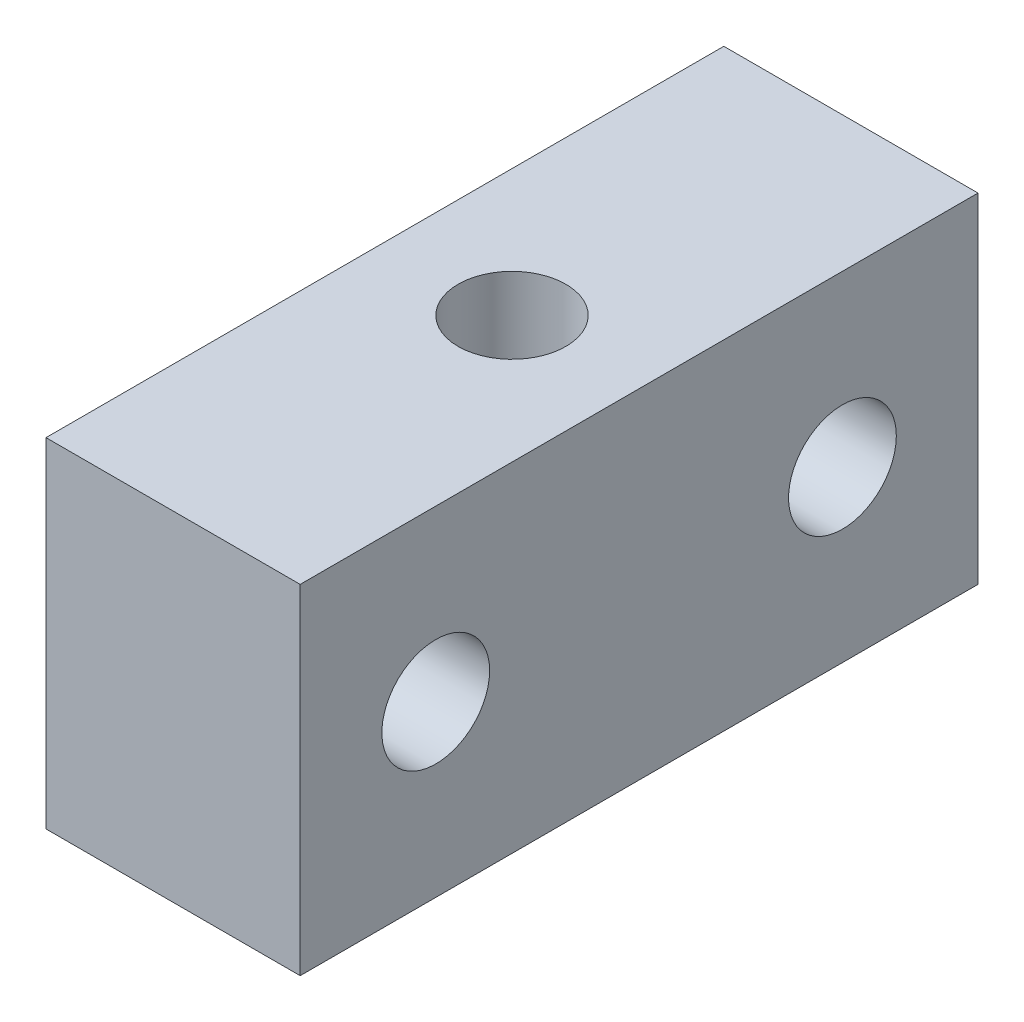
ISO-10303-21;
HEADER;
FILE_DESCRIPTION(('STEP AP214'),'2;1');
FILE_NAME('part.step','',(''),(''),'','','');
FILE_SCHEMA(('AUTOMOTIVE_DESIGN { 1 0 10303 214 1 1 1 1 }'));
ENDSEC;
DATA;
#1=APPLICATION_CONTEXT('core data for automotive mechanical design processes');
#2=APPLICATION_PROTOCOL_DEFINITION('international standard','automotive_design',2000,#1);
#3=PRODUCT_CONTEXT('',#1,'mechanical');
#4=PRODUCT('Part','Part','',(#3));
#5=PRODUCT_RELATED_PRODUCT_CATEGORY('part','',(#4));
#6=PRODUCT_DEFINITION_FORMATION('','',#4);
#7=PRODUCT_DEFINITION_CONTEXT('part definition',#1,'design');
#8=PRODUCT_DEFINITION('design','',#6,#7);
#9=PRODUCT_DEFINITION_SHAPE('','',#8);
#10=(LENGTH_UNIT() NAMED_UNIT(*) SI_UNIT(.MILLI.,.METRE.));
#11=(NAMED_UNIT(*) PLANE_ANGLE_UNIT() SI_UNIT($,.RADIAN.));
#12=(NAMED_UNIT(*) SI_UNIT($,.STERADIAN.) SOLID_ANGLE_UNIT());
#13=UNCERTAINTY_MEASURE_WITH_UNIT(LENGTH_MEASURE(1.E-05),#10,'distance_accuracy_value','');
#14=(GEOMETRIC_REPRESENTATION_CONTEXT(3) GLOBAL_UNCERTAINTY_ASSIGNED_CONTEXT((#13)) GLOBAL_UNIT_ASSIGNED_CONTEXT((#10,
#11,#12)) REPRESENTATION_CONTEXT('',''));
#15=CARTESIAN_POINT('',(0.,0.,0.));
#16=DIRECTION('',(0.,0.,1.));
#17=DIRECTION('',(1.,0.,0.));
#18=AXIS2_PLACEMENT_3D('',#15,#16,#17);
#19=CARTESIAN_POINT('',(4.7625,6.35,12.7));
#20=DIRECTION('',(0.,-1.,0.));
#21=DIRECTION('',(0.,0.,-1.));
#22=AXIS2_PLACEMENT_3D('',#19,#20,#21);
#23=PLANE('',#22);
#24=CARTESIAN_POINT('',(0.,6.35,0.));
#25=DIRECTION('',(0.,1.,0.));
#26=DIRECTION('',(0.,0.,1.));
#27=AXIS2_PLACEMENT_3D('',#24,#25,#26);
#28=CIRCLE('',#27,2.0193);
#29=CARTESIAN_POINT('',(0.,6.35,2.0193));
#30=VERTEX_POINT('',#29);
#31=EDGE_CURVE('E115',#30,#30,#28,.T.);
#32=ORIENTED_EDGE('',*,*,#31,.F.);
#33=EDGE_LOOP('',(#32));
#34=FACE_BOUND('',#33,.T.);
#35=DIRECTION('',(0.,0.,1.));
#36=VECTOR('',#35,1.);
#37=CARTESIAN_POINT('',(-4.7625,6.35,12.7));
#38=LINE('',#37,#36);
#39=CARTESIAN_POINT('',(-4.7625,6.35,-12.7));
#40=VERTEX_POINT('',#39);
#41=CARTESIAN_POINT('',(-4.7625,6.35,12.7));
#42=VERTEX_POINT('',#41);
#43=EDGE_CURVE('E99',#40,#42,#38,.T.);
#44=ORIENTED_EDGE('',*,*,#43,.T.);
#45=DIRECTION('',(-1.,0.,0.));
#46=VECTOR('',#45,1.);
#47=CARTESIAN_POINT('',(4.7625,6.35,12.7));
#48=LINE('',#47,#46);
#49=CARTESIAN_POINT('',(4.7625,6.35,12.7));
#50=VERTEX_POINT('',#49);
#51=EDGE_CURVE('E11',#50,#42,#48,.T.);
#52=ORIENTED_EDGE('',*,*,#51,.F.);
#53=DIRECTION('',(0.,0.,1.));
#54=VECTOR('',#53,1.);
#55=CARTESIAN_POINT('',(4.7625,6.35,12.7));
#56=LINE('',#55,#54);
#57=CARTESIAN_POINT('',(4.7625,6.35,-12.7));
#58=VERTEX_POINT('',#57);
#59=EDGE_CURVE('E87',#58,#50,#56,.T.);
#60=ORIENTED_EDGE('',*,*,#59,.F.);
#61=DIRECTION('',(-1.,0.,0.));
#62=VECTOR('',#61,1.);
#63=CARTESIAN_POINT('',(4.7625,6.35,-12.7));
#64=LINE('',#63,#62);
#65=EDGE_CURVE('E95',#58,#40,#64,.T.);
#66=ORIENTED_EDGE('',*,*,#65,.T.);
#67=EDGE_LOOP('',(#44,#52,#60,#66));
#68=FACE_BOUND('',#67,.T.);
#69=ADVANCED_FACE('F36',(#34,#68),#23,.F.);
#70=CARTESIAN_POINT('',(4.7625,6.35,12.7));
#71=DIRECTION('',(0.,0.,-1.));
#72=DIRECTION('',(-1.,0.,0.));
#73=AXIS2_PLACEMENT_3D('',#70,#71,#72);
#74=PLANE('',#73);
#75=DIRECTION('',(0.,-1.,0.));
#76=VECTOR('',#75,1.);
#77=CARTESIAN_POINT('',(-4.7625,6.35,12.7));
#78=LINE('',#77,#76);
#79=CARTESIAN_POINT('',(-4.7625,-6.35,12.7));
#80=VERTEX_POINT('',#79);
#81=EDGE_CURVE('E91',#42,#80,#78,.T.);
#82=ORIENTED_EDGE('',*,*,#81,.T.);
#83=DIRECTION('',(-1.,0.,0.));
#84=VECTOR('',#83,1.);
#85=CARTESIAN_POINT('',(4.7625,-6.35,12.7));
#86=LINE('',#85,#84);
#87=CARTESIAN_POINT('',(4.7625,-6.35,12.7));
#88=VERTEX_POINT('',#87);
#89=EDGE_CURVE('E44',#88,#80,#86,.T.);
#90=ORIENTED_EDGE('',*,*,#89,.F.);
#91=DIRECTION('',(0.,-1.,0.));
#92=VECTOR('',#91,1.);
#93=CARTESIAN_POINT('',(4.7625,6.35,12.7));
#94=LINE('',#93,#92);
#95=EDGE_CURVE('E82',#50,#88,#94,.T.);
#96=ORIENTED_EDGE('',*,*,#95,.F.);
#97=ORIENTED_EDGE('',*,*,#51,.T.);
#98=EDGE_LOOP('',(#82,#90,#96,#97));
#99=FACE_BOUND('',#98,.T.);
#100=ADVANCED_FACE('F90',(#99),#74,.F.);
#101=CARTESIAN_POINT('',(4.7625,-6.35,12.7));
#102=DIRECTION('',(0.,1.,0.));
#103=DIRECTION('',(0.,0.,1.));
#104=AXIS2_PLACEMENT_3D('',#101,#102,#103);
#105=PLANE('',#104);
#106=CARTESIAN_POINT('',(0.,-6.35,0.));
#107=DIRECTION('',(0.,1.,0.));
#108=DIRECTION('',(0.,0.,1.));
#109=AXIS2_PLACEMENT_3D('',#106,#107,#108);
#110=CIRCLE('',#109,2.0193);
#111=CARTESIAN_POINT('',(0.,-6.35,2.0193));
#112=VERTEX_POINT('',#111);
#113=EDGE_CURVE('E102',#112,#112,#110,.T.);
#114=ORIENTED_EDGE('',*,*,#113,.T.);
#115=EDGE_LOOP('',(#114));
#116=FACE_BOUND('',#115,.T.);
#117=DIRECTION('',(0.,0.,-1.));
#118=VECTOR('',#117,1.);
#119=CARTESIAN_POINT('',(-4.7625,-6.35,12.7));
#120=LINE('',#119,#118);
#121=CARTESIAN_POINT('',(-4.7625,-6.35,-12.7));
#122=VERTEX_POINT('',#121);
#123=EDGE_CURVE('E69',#80,#122,#120,.T.);
#124=ORIENTED_EDGE('',*,*,#123,.T.);
#125=DIRECTION('',(-1.,0.,0.));
#126=VECTOR('',#125,1.);
#127=CARTESIAN_POINT('',(4.7625,-6.35,-12.7));
#128=LINE('',#127,#126);
#129=CARTESIAN_POINT('',(4.7625,-6.35,-12.7));
#130=VERTEX_POINT('',#129);
#131=EDGE_CURVE('E92',#130,#122,#128,.T.);
#132=ORIENTED_EDGE('',*,*,#131,.F.);
#133=DIRECTION('',(0.,0.,-1.));
#134=VECTOR('',#133,1.);
#135=CARTESIAN_POINT('',(4.7625,-6.35,12.7));
#136=LINE('',#135,#134);
#137=EDGE_CURVE('E85',#88,#130,#136,.T.);
#138=ORIENTED_EDGE('',*,*,#137,.F.);
#139=ORIENTED_EDGE('',*,*,#89,.T.);
#140=EDGE_LOOP('',(#124,#132,#138,#139));
#141=FACE_BOUND('',#140,.T.);
#142=ADVANCED_FACE('F93',(#116,#141),#105,.F.);
#143=CARTESIAN_POINT('',(4.7625,6.35,-12.7));
#144=DIRECTION('',(0.,0.,1.));
#145=DIRECTION('',(1.,0.,0.));
#146=AXIS2_PLACEMENT_3D('',#143,#144,#145);
#147=PLANE('',#146);
#148=DIRECTION('',(0.,1.,0.));
#149=VECTOR('',#148,1.);
#150=CARTESIAN_POINT('',(-4.7625,6.35,-12.7));
#151=LINE('',#150,#149);
#152=EDGE_CURVE('E75',#122,#40,#151,.T.);
#153=ORIENTED_EDGE('',*,*,#152,.T.);
#154=ORIENTED_EDGE('',*,*,#65,.F.);
#155=DIRECTION('',(0.,1.,0.));
#156=VECTOR('',#155,1.);
#157=CARTESIAN_POINT('',(4.7625,6.35,-12.7));
#158=LINE('',#157,#156);
#159=EDGE_CURVE('E52',#130,#58,#158,.T.);
#160=ORIENTED_EDGE('',*,*,#159,.F.);
#161=ORIENTED_EDGE('',*,*,#131,.T.);
#162=EDGE_LOOP('',(#153,#154,#160,#161));
#163=FACE_BOUND('',#162,.T.);
#164=ADVANCED_FACE('F107',(#163),#147,.F.);
#165=CARTESIAN_POINT('',(4.7625,0.,0.));
#166=DIRECTION('',(-1.,0.,0.));
#167=DIRECTION('',(0.,0.,1.));
#168=AXIS2_PLACEMENT_3D('',#165,#166,#167);
#169=PLANE('',#168);
#170=CARTESIAN_POINT('',(4.7625,0.,7.62));
#171=DIRECTION('',(1.,0.,0.));
#172=DIRECTION('',(0.,0.,-1.));
#173=AXIS2_PLACEMENT_3D('',#170,#171,#172);
#174=CIRCLE('',#173,2.01929999999999);
#175=CARTESIAN_POINT('',(4.7625,0.,5.60070000000001));
#176=VERTEX_POINT('',#175);
#177=EDGE_CURVE('E127',#176,#176,#174,.T.);
#178=ORIENTED_EDGE('',*,*,#177,.F.);
#179=EDGE_LOOP('',(#178));
#180=FACE_BOUND('',#179,.T.);
#181=CARTESIAN_POINT('',(4.7625,0.,-7.62));
#182=DIRECTION('',(1.,0.,0.));
#183=DIRECTION('',(0.,0.,-1.));
#184=AXIS2_PLACEMENT_3D('',#181,#182,#183);
#185=CIRCLE('',#184,2.01929999999999);
#186=CARTESIAN_POINT('',(4.7625,0.,-9.63929999999999));
#187=VERTEX_POINT('',#186);
#188=EDGE_CURVE('E121',#187,#187,#185,.T.);
#189=ORIENTED_EDGE('',*,*,#188,.F.);
#190=EDGE_LOOP('',(#189));
#191=FACE_BOUND('',#190,.T.);
#192=ORIENTED_EDGE('',*,*,#59,.T.);
#193=ORIENTED_EDGE('',*,*,#95,.T.);
#194=ORIENTED_EDGE('',*,*,#137,.T.);
#195=ORIENTED_EDGE('',*,*,#159,.T.);
#196=EDGE_LOOP('',(#192,#193,#194,#195));
#197=FACE_BOUND('',#196,.T.);
#198=ADVANCED_FACE('F83',(#180,#191,#197),#169,.F.);
#199=CARTESIAN_POINT('',(-4.7625,0.,0.));
#200=DIRECTION('',(-1.,0.,0.));
#201=DIRECTION('',(0.,0.,1.));
#202=AXIS2_PLACEMENT_3D('',#199,#200,#201);
#203=PLANE('',#202);
#204=CARTESIAN_POINT('',(-4.7625,0.,7.62));
#205=DIRECTION('',(1.,0.,0.));
#206=DIRECTION('',(0.,0.,-1.));
#207=AXIS2_PLACEMENT_3D('',#204,#205,#206);
#208=CIRCLE('',#207,2.0193);
#209=CARTESIAN_POINT('',(-4.7625,0.,5.6007));
#210=VERTEX_POINT('',#209);
#211=EDGE_CURVE('E124',#210,#210,#208,.T.);
#212=ORIENTED_EDGE('',*,*,#211,.T.);
#213=EDGE_LOOP('',(#212));
#214=FACE_BOUND('',#213,.T.);
#215=CARTESIAN_POINT('',(-4.7625,0.,-7.62));
#216=DIRECTION('',(1.,0.,0.));
#217=DIRECTION('',(0.,0.,-1.));
#218=AXIS2_PLACEMENT_3D('',#215,#216,#217);
#219=CIRCLE('',#218,2.0193);
#220=CARTESIAN_POINT('',(-4.7625,0.,-9.6393));
#221=VERTEX_POINT('',#220);
#222=EDGE_CURVE('E118',#221,#221,#219,.T.);
#223=ORIENTED_EDGE('',*,*,#222,.T.);
#224=EDGE_LOOP('',(#223));
#225=FACE_BOUND('',#224,.T.);
#226=ORIENTED_EDGE('',*,*,#43,.F.);
#227=ORIENTED_EDGE('',*,*,#152,.F.);
#228=ORIENTED_EDGE('',*,*,#123,.F.);
#229=ORIENTED_EDGE('',*,*,#81,.F.);
#230=EDGE_LOOP('',(#226,#227,#228,#229));
#231=FACE_BOUND('',#230,.T.);
#232=ADVANCED_FACE('F110',(#214,#225,#231),#203,.T.);
#233=CARTESIAN_POINT('',(0.,6.35,0.));
#234=DIRECTION('',(0.,1.,0.));
#235=DIRECTION('',(0.,0.,1.));
#236=AXIS2_PLACEMENT_3D('',#233,#234,#235);
#237=CYLINDRICAL_SURFACE('',#236,2.0193);
#238=ORIENTED_EDGE('',*,*,#113,.F.);
#239=EDGE_LOOP('',(#238));
#240=FACE_BOUND('',#239,.T.);
#241=ORIENTED_EDGE('',*,*,#31,.T.);
#242=EDGE_LOOP('',(#241));
#243=FACE_BOUND('',#242,.T.);
#244=ADVANCED_FACE('F140',(#240,#243),#237,.F.);
#245=CARTESIAN_POINT('',(4.7625,0.,-7.62));
#246=DIRECTION('',(1.,0.,0.));
#247=DIRECTION('',(0.,0.,-1.));
#248=AXIS2_PLACEMENT_3D('',#245,#246,#247);
#249=CYLINDRICAL_SURFACE('',#248,2.01929999999999);
#250=ORIENTED_EDGE('',*,*,#222,.F.);
#251=EDGE_LOOP('',(#250));
#252=FACE_BOUND('',#251,.T.);
#253=ORIENTED_EDGE('',*,*,#188,.T.);
#254=EDGE_LOOP('',(#253));
#255=FACE_BOUND('',#254,.T.);
#256=ADVANCED_FACE('F138',(#252,#255),#249,.F.);
#257=CARTESIAN_POINT('',(4.7625,0.,7.62));
#258=DIRECTION('',(1.,0.,0.));
#259=DIRECTION('',(0.,0.,-1.));
#260=AXIS2_PLACEMENT_3D('',#257,#258,#259);
#261=CYLINDRICAL_SURFACE('',#260,2.01929999999999);
#262=ORIENTED_EDGE('',*,*,#211,.F.);
#263=EDGE_LOOP('',(#262));
#264=FACE_BOUND('',#263,.T.);
#265=ORIENTED_EDGE('',*,*,#177,.T.);
#266=EDGE_LOOP('',(#265));
#267=FACE_BOUND('',#266,.T.);
#268=ADVANCED_FACE('F131',(#264,#267),#261,.F.);
#269=CLOSED_SHELL('',(#69,#100,#142,#164,#198,#232,#244,#256,#268));
#270=MANIFOLD_SOLID_BREP('B2',#269);
#271=ADVANCED_BREP_SHAPE_REPRESENTATION('',(#18,#270),#14);
#272=SHAPE_DEFINITION_REPRESENTATION(#9,#271);
ENDSEC;
END-ISO-10303-21;
